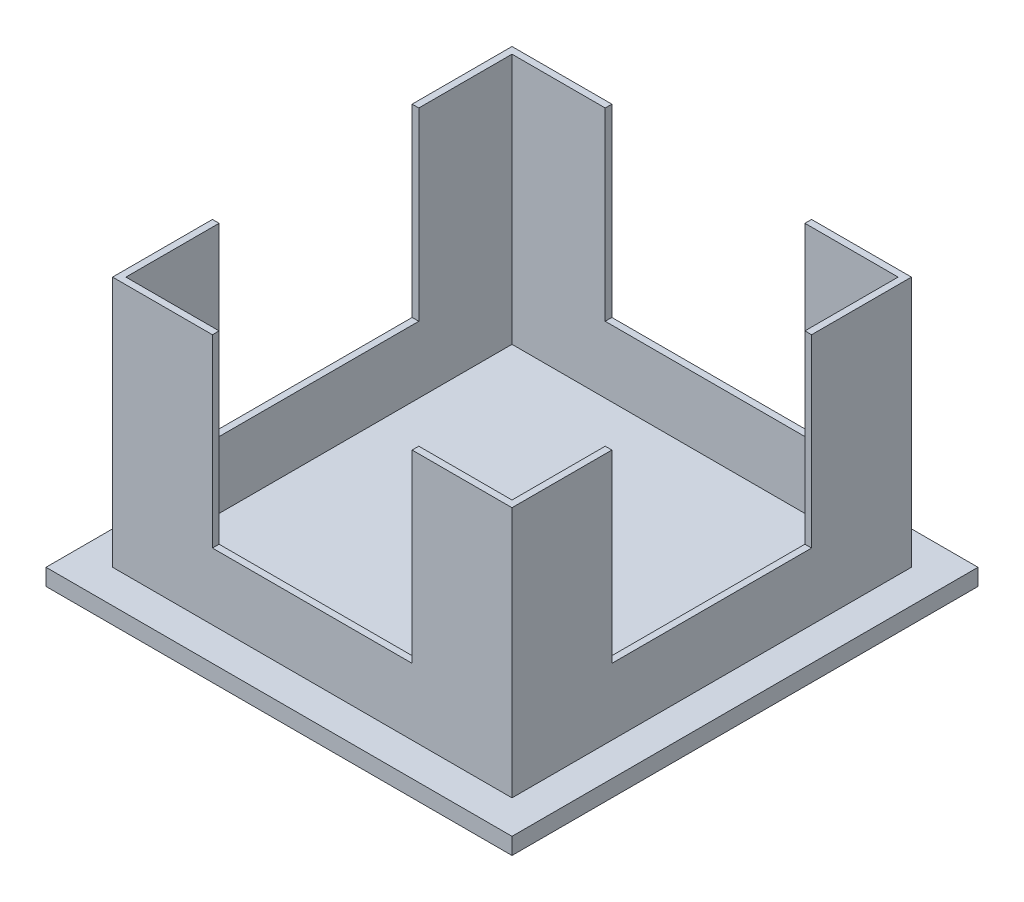
ISO-10303-21;
HEADER;
FILE_DESCRIPTION(('STEP AP214'),'2;1');
FILE_NAME('part.step','',(''),(''),'','','');
FILE_SCHEMA(('AUTOMOTIVE_DESIGN { 1 0 10303 214 1 1 1 1 }'));
ENDSEC;
DATA;
#1=APPLICATION_CONTEXT('core data for automotive mechanical design processes');
#2=APPLICATION_PROTOCOL_DEFINITION('international standard','automotive_design',2000,#1);
#3=PRODUCT_CONTEXT('',#1,'mechanical');
#4=PRODUCT('Part','Part','',(#3));
#5=PRODUCT_RELATED_PRODUCT_CATEGORY('part','',(#4));
#6=PRODUCT_DEFINITION_FORMATION('','',#4);
#7=PRODUCT_DEFINITION_CONTEXT('part definition',#1,'design');
#8=PRODUCT_DEFINITION('design','',#6,#7);
#9=PRODUCT_DEFINITION_SHAPE('','',#8);
#10=(LENGTH_UNIT() NAMED_UNIT(*) SI_UNIT(.MILLI.,.METRE.));
#11=(NAMED_UNIT(*) PLANE_ANGLE_UNIT() SI_UNIT($,.RADIAN.));
#12=(NAMED_UNIT(*) SI_UNIT($,.STERADIAN.) SOLID_ANGLE_UNIT());
#13=UNCERTAINTY_MEASURE_WITH_UNIT(LENGTH_MEASURE(1.E-05),#10,'distance_accuracy_value','');
#14=(GEOMETRIC_REPRESENTATION_CONTEXT(3) GLOBAL_UNCERTAINTY_ASSIGNED_CONTEXT((#13)) GLOBAL_UNIT_ASSIGNED_CONTEXT((#10,
#11,#12)) REPRESENTATION_CONTEXT('',''));
#15=CARTESIAN_POINT('',(0.,0.,0.));
#16=DIRECTION('',(0.,0.,1.));
#17=DIRECTION('',(1.,0.,0.));
#18=AXIS2_PLACEMENT_3D('',#15,#16,#17);
#19=CARTESIAN_POINT('',(0.,80.5,0.));
#20=DIRECTION('',(0.,-1.,0.));
#21=DIRECTION('',(0.,0.,-1.));
#22=AXIS2_PLACEMENT_3D('',#19,#20,#21);
#23=PLANE('',#22);
#24=DIRECTION('',(0.,0.,1.));
#25=VECTOR('',#24,1.);
#26=CARTESIAN_POINT('',(-58.,80.5,58.));
#27=LINE('',#26,#25);
#28=CARTESIAN_POINT('',(-58.,80.5,30.));
#29=VERTEX_POINT('',#28);
#30=CARTESIAN_POINT('',(-58.,80.5,58.));
#31=VERTEX_POINT('',#30);
#32=EDGE_CURVE('E346',#29,#31,#27,.T.);
#33=ORIENTED_EDGE('',*,*,#32,.F.);
#34=DIRECTION('',(1.,0.,0.));
#35=VECTOR('',#34,1.);
#36=CARTESIAN_POINT('',(-70.,80.5,30.));
#37=LINE('',#36,#35);
#38=CARTESIAN_POINT('',(-60.,80.5,30.));
#39=VERTEX_POINT('',#38);
#40=EDGE_CURVE('E264',#39,#29,#37,.T.);
#41=ORIENTED_EDGE('',*,*,#40,.F.);
#42=DIRECTION('',(0.,0.,1.));
#43=VECTOR('',#42,1.);
#44=CARTESIAN_POINT('',(-60.,80.5,60.));
#45=LINE('',#44,#43);
#46=CARTESIAN_POINT('',(-60.,80.5,60.));
#47=VERTEX_POINT('',#46);
#48=EDGE_CURVE('E395',#39,#47,#45,.T.);
#49=ORIENTED_EDGE('',*,*,#48,.T.);
#50=DIRECTION('',(1.,0.,0.));
#51=VECTOR('',#50,1.);
#52=CARTESIAN_POINT('',(-60.,80.5,60.));
#53=LINE('',#52,#51);
#54=CARTESIAN_POINT('',(-30.,80.5,60.));
#55=VERTEX_POINT('',#54);
#56=EDGE_CURVE('E400',#47,#55,#53,.T.);
#57=ORIENTED_EDGE('',*,*,#56,.T.);
#58=DIRECTION('',(0.,0.,-1.));
#59=VECTOR('',#58,1.);
#60=CARTESIAN_POINT('',(-30.,80.5,70.));
#61=LINE('',#60,#59);
#62=CARTESIAN_POINT('',(-30.,80.5,58.));
#63=VERTEX_POINT('',#62);
#64=EDGE_CURVE('E297',#55,#63,#61,.T.);
#65=ORIENTED_EDGE('',*,*,#64,.T.);
#66=DIRECTION('',(1.,0.,0.));
#67=VECTOR('',#66,1.);
#68=CARTESIAN_POINT('',(-58.,80.5,58.));
#69=LINE('',#68,#67);
#70=EDGE_CURVE('E352',#31,#63,#69,.T.);
#71=ORIENTED_EDGE('',*,*,#70,.F.);
#72=EDGE_LOOP('',(#33,#41,#49,#57,#65,#71));
#73=FACE_BOUND('',#72,.T.);
#74=ADVANCED_FACE('F45',(#73),#23,.F.);
#75=DIRECTION('',(0.,0.,-1.));
#76=VECTOR('',#75,1.);
#77=CARTESIAN_POINT('',(60.,80.5,60.));
#78=LINE('',#77,#76);
#79=CARTESIAN_POINT('',(60.,80.5,60.));
#80=VERTEX_POINT('',#79);
#81=CARTESIAN_POINT('',(60.,80.5,30.));
#82=VERTEX_POINT('',#81);
#83=EDGE_CURVE('E385',#80,#82,#78,.T.);
#84=ORIENTED_EDGE('',*,*,#83,.T.);
#85=CARTESIAN_POINT('',(58.,80.5,30.));
#86=VERTEX_POINT('',#85);
#87=EDGE_CURVE('E502',#86,#82,#37,.T.);
#88=ORIENTED_EDGE('',*,*,#87,.F.);
#89=DIRECTION('',(0.,0.,-1.));
#90=VECTOR('',#89,1.);
#91=CARTESIAN_POINT('',(58.,80.5,58.));
#92=LINE('',#91,#90);
#93=CARTESIAN_POINT('',(58.,80.5,58.));
#94=VERTEX_POINT('',#93);
#95=EDGE_CURVE('E336',#94,#86,#92,.T.);
#96=ORIENTED_EDGE('',*,*,#95,.F.);
#97=CARTESIAN_POINT('',(30.,80.5,58.));
#98=VERTEX_POINT('',#97);
#99=EDGE_CURVE('E351',#98,#94,#69,.T.);
#100=ORIENTED_EDGE('',*,*,#99,.F.);
#101=DIRECTION('',(0.,0.,-1.));
#102=VECTOR('',#101,1.);
#103=CARTESIAN_POINT('',(30.,80.5,70.));
#104=LINE('',#103,#102);
#105=CARTESIAN_POINT('',(30.,80.5,60.));
#106=VERTEX_POINT('',#105);
#107=EDGE_CURVE('E293',#106,#98,#104,.T.);
#108=ORIENTED_EDGE('',*,*,#107,.F.);
#109=EDGE_CURVE('E399',#106,#80,#53,.T.);
#110=ORIENTED_EDGE('',*,*,#109,.T.);
#111=EDGE_LOOP('',(#84,#88,#96,#100,#108,#110));
#112=FACE_BOUND('',#111,.T.);
#113=ADVANCED_FACE('F544',(#112),#23,.F.);
#114=CARTESIAN_POINT('',(-60.,80.5,-60.));
#115=VERTEX_POINT('',#114);
#116=CARTESIAN_POINT('',(-60.,80.5,-30.));
#117=VERTEX_POINT('',#116);
#118=EDGE_CURVE('E396',#115,#117,#45,.T.);
#119=ORIENTED_EDGE('',*,*,#118,.T.);
#120=DIRECTION('',(1.,0.,0.));
#121=VECTOR('',#120,1.);
#122=CARTESIAN_POINT('',(-70.,80.5,-30.));
#123=LINE('',#122,#121);
#124=CARTESIAN_POINT('',(-58.,80.5,-30.));
#125=VERTEX_POINT('',#124);
#126=EDGE_CURVE('E236',#117,#125,#123,.T.);
#127=ORIENTED_EDGE('',*,*,#126,.T.);
#128=CARTESIAN_POINT('',(-58.,80.5,-58.));
#129=VERTEX_POINT('',#128);
#130=EDGE_CURVE('E347',#129,#125,#27,.T.);
#131=ORIENTED_EDGE('',*,*,#130,.F.);
#132=DIRECTION('',(-1.,0.,0.));
#133=VECTOR('',#132,1.);
#134=CARTESIAN_POINT('',(-58.,80.5,-58.));
#135=LINE('',#134,#133);
#136=CARTESIAN_POINT('',(-30.,80.5,-58.));
#137=VERTEX_POINT('',#136);
#138=EDGE_CURVE('E340',#137,#129,#135,.T.);
#139=ORIENTED_EDGE('',*,*,#138,.F.);
#140=CARTESIAN_POINT('',(-30.,80.5,-60.));
#141=VERTEX_POINT('',#140);
#142=EDGE_CURVE('E282',#137,#141,#61,.T.);
#143=ORIENTED_EDGE('',*,*,#142,.T.);
#144=DIRECTION('',(-1.,0.,0.));
#145=VECTOR('',#144,1.);
#146=CARTESIAN_POINT('',(-60.,80.5,-60.));
#147=LINE('',#146,#145);
#148=EDGE_CURVE('E389',#141,#115,#147,.T.);
#149=ORIENTED_EDGE('',*,*,#148,.T.);
#150=EDGE_LOOP('',(#119,#127,#131,#139,#143,#149));
#151=FACE_BOUND('',#150,.T.);
#152=ADVANCED_FACE('F499',(#151),#23,.F.);
#153=CARTESIAN_POINT('',(0.,5.,0.));
#154=DIRECTION('',(0.,-1.,0.));
#155=DIRECTION('',(0.,0.,-1.));
#156=AXIS2_PLACEMENT_3D('',#153,#154,#155);
#157=PLANE('',#156);
#158=DIRECTION('',(0.,0.,-1.));
#159=VECTOR('',#158,1.);
#160=CARTESIAN_POINT('',(70.,5.,70.));
#161=LINE('',#160,#159);
#162=CARTESIAN_POINT('',(70.,5.,70.));
#163=VERTEX_POINT('',#162);
#164=CARTESIAN_POINT('',(70.,5.,-70.));
#165=VERTEX_POINT('',#164);
#166=EDGE_CURVE('E444',#163,#165,#161,.T.);
#167=ORIENTED_EDGE('',*,*,#166,.T.);
#168=DIRECTION('',(-1.,0.,0.));
#169=VECTOR('',#168,1.);
#170=CARTESIAN_POINT('',(-70.,5.,-70.));
#171=LINE('',#170,#169);
#172=CARTESIAN_POINT('',(-70.,5.,-70.));
#173=VERTEX_POINT('',#172);
#174=EDGE_CURVE('E448',#165,#173,#171,.T.);
#175=ORIENTED_EDGE('',*,*,#174,.T.);
#176=DIRECTION('',(0.,0.,1.));
#177=VECTOR('',#176,1.);
#178=CARTESIAN_POINT('',(-70.,5.,70.));
#179=LINE('',#178,#177);
#180=CARTESIAN_POINT('',(-70.,5.,70.));
#181=VERTEX_POINT('',#180);
#182=EDGE_CURVE('E452',#173,#181,#179,.T.);
#183=ORIENTED_EDGE('',*,*,#182,.T.);
#184=DIRECTION('',(1.,0.,0.));
#185=VECTOR('',#184,1.);
#186=CARTESIAN_POINT('',(-70.,5.,70.));
#187=LINE('',#186,#185);
#188=EDGE_CURVE('E455',#181,#163,#187,.T.);
#189=ORIENTED_EDGE('',*,*,#188,.T.);
#190=EDGE_LOOP('',(#167,#175,#183,#189));
#191=FACE_BOUND('',#190,.T.);
#192=DIRECTION('',(0.,0.,-1.));
#193=VECTOR('',#192,1.);
#194=CARTESIAN_POINT('',(60.,5.,60.));
#195=LINE('',#194,#193);
#196=CARTESIAN_POINT('',(60.,5.,60.));
#197=VERTEX_POINT('',#196);
#198=CARTESIAN_POINT('',(60.,5.,-60.));
#199=VERTEX_POINT('',#198);
#200=EDGE_CURVE('E384',#197,#199,#195,.T.);
#201=ORIENTED_EDGE('',*,*,#200,.F.);
#202=DIRECTION('',(1.,0.,0.));
#203=VECTOR('',#202,1.);
#204=CARTESIAN_POINT('',(-60.,5.,60.));
#205=LINE('',#204,#203);
#206=CARTESIAN_POINT('',(-60.,5.,60.));
#207=VERTEX_POINT('',#206);
#208=EDGE_CURVE('E416',#207,#197,#205,.T.);
#209=ORIENTED_EDGE('',*,*,#208,.F.);
#210=DIRECTION('',(0.,0.,1.));
#211=VECTOR('',#210,1.);
#212=CARTESIAN_POINT('',(-60.,5.,60.));
#213=LINE('',#212,#211);
#214=CARTESIAN_POINT('',(-60.,5.,-60.));
#215=VERTEX_POINT('',#214);
#216=EDGE_CURVE('E412',#215,#207,#213,.T.);
#217=ORIENTED_EDGE('',*,*,#216,.F.);
#218=DIRECTION('',(-1.,0.,0.));
#219=VECTOR('',#218,1.);
#220=CARTESIAN_POINT('',(-60.,5.,-60.));
#221=LINE('',#220,#219);
#222=EDGE_CURVE('E408',#199,#215,#221,.T.);
#223=ORIENTED_EDGE('',*,*,#222,.F.);
#224=EDGE_LOOP('',(#201,#209,#217,#223));
#225=FACE_BOUND('',#224,.T.);
#226=ADVANCED_FACE('F588',(#191,#225),#157,.F.);
#227=DIRECTION('',(1.,0.,0.));
#228=VECTOR('',#227,1.);
#229=CARTESIAN_POINT('',(-58.,5.,58.));
#230=LINE('',#229,#228);
#231=CARTESIAN_POINT('',(-58.,5.,58.));
#232=VERTEX_POINT('',#231);
#233=CARTESIAN_POINT('',(58.,5.,58.));
#234=VERTEX_POINT('',#233);
#235=EDGE_CURVE('E368',#232,#234,#230,.T.);
#236=ORIENTED_EDGE('',*,*,#235,.T.);
#237=DIRECTION('',(0.,0.,-1.));
#238=VECTOR('',#237,1.);
#239=CARTESIAN_POINT('',(58.,5.,58.));
#240=LINE('',#239,#238);
#241=CARTESIAN_POINT('',(58.,5.,-58.));
#242=VERTEX_POINT('',#241);
#243=EDGE_CURVE('E335',#234,#242,#240,.T.);
#244=ORIENTED_EDGE('',*,*,#243,.T.);
#245=DIRECTION('',(-1.,0.,0.));
#246=VECTOR('',#245,1.);
#247=CARTESIAN_POINT('',(-58.,5.,-58.));
#248=LINE('',#247,#246);
#249=CARTESIAN_POINT('',(-58.,5.,-58.));
#250=VERTEX_POINT('',#249);
#251=EDGE_CURVE('E360',#242,#250,#248,.T.);
#252=ORIENTED_EDGE('',*,*,#251,.T.);
#253=DIRECTION('',(0.,0.,1.));
#254=VECTOR('',#253,1.);
#255=CARTESIAN_POINT('',(-58.,5.,58.));
#256=LINE('',#255,#254);
#257=EDGE_CURVE('E364',#250,#232,#256,.T.);
#258=ORIENTED_EDGE('',*,*,#257,.T.);
#259=EDGE_LOOP('',(#236,#244,#252,#258));
#260=FACE_BOUND('',#259,.T.);
#261=CARTESIAN_POINT('',(0.,5.,0.));
#262=DIRECTION('',(0.,1.,0.));
#263=DIRECTION('',(0.,0.,1.));
#264=AXIS2_PLACEMENT_3D('',#261,#262,#263);
#265=CIRCLE('',#264,10.5);
#266=CARTESIAN_POINT('',(0.,5.,10.5));
#267=VERTEX_POINT('',#266);
#268=EDGE_CURVE('E436',#267,#267,#265,.T.);
#269=ORIENTED_EDGE('',*,*,#268,.F.);
#270=EDGE_LOOP('',(#269));
#271=FACE_BOUND('',#270,.T.);
#272=ADVANCED_FACE('F584',(#260,#271),#157,.F.);
#273=CARTESIAN_POINT('',(0.,0.,0.));
#274=DIRECTION('',(0.,-1.,0.));
#275=DIRECTION('',(0.,0.,-1.));
#276=AXIS2_PLACEMENT_3D('',#273,#274,#275);
#277=PLANE('',#276);
#278=DIRECTION('',(0.,0.,-1.));
#279=VECTOR('',#278,1.);
#280=CARTESIAN_POINT('',(70.,0.,70.));
#281=LINE('',#280,#279);
#282=CARTESIAN_POINT('',(70.,0.,70.));
#283=VERTEX_POINT('',#282);
#284=CARTESIAN_POINT('',(70.,0.,-70.));
#285=VERTEX_POINT('',#284);
#286=EDGE_CURVE('E440',#283,#285,#281,.T.);
#287=ORIENTED_EDGE('',*,*,#286,.F.);
#288=DIRECTION('',(1.,0.,0.));
#289=VECTOR('',#288,1.);
#290=CARTESIAN_POINT('',(-70.,0.,70.));
#291=LINE('',#290,#289);
#292=CARTESIAN_POINT('',(-70.,0.,70.));
#293=VERTEX_POINT('',#292);
#294=EDGE_CURVE('E449',#293,#283,#291,.T.);
#295=ORIENTED_EDGE('',*,*,#294,.F.);
#296=DIRECTION('',(0.,0.,1.));
#297=VECTOR('',#296,1.);
#298=CARTESIAN_POINT('',(-70.,0.,70.));
#299=LINE('',#298,#297);
#300=CARTESIAN_POINT('',(-70.,0.,-70.));
#301=VERTEX_POINT('',#300);
#302=EDGE_CURVE('E465',#301,#293,#299,.T.);
#303=ORIENTED_EDGE('',*,*,#302,.F.);
#304=DIRECTION('',(-1.,0.,0.));
#305=VECTOR('',#304,1.);
#306=CARTESIAN_POINT('',(-70.,0.,-70.));
#307=LINE('',#306,#305);
#308=EDGE_CURVE('E462',#285,#301,#307,.T.);
#309=ORIENTED_EDGE('',*,*,#308,.F.);
#310=EDGE_LOOP('',(#287,#295,#303,#309));
#311=FACE_BOUND('',#310,.T.);
#312=CARTESIAN_POINT('',(0.,0.,0.));
#313=DIRECTION('',(0.,1.,0.));
#314=DIRECTION('',(0.,0.,1.));
#315=AXIS2_PLACEMENT_3D('',#312,#313,#314);
#316=CIRCLE('',#315,10.5);
#317=CARTESIAN_POINT('',(0.,0.,10.5));
#318=VERTEX_POINT('',#317);
#319=EDGE_CURVE('E435',#318,#318,#316,.T.);
#320=ORIENTED_EDGE('',*,*,#319,.T.);
#321=EDGE_LOOP('',(#320));
#322=FACE_BOUND('',#321,.T.);
#323=ADVANCED_FACE('F587',(#311,#322),#277,.T.);
#324=CARTESIAN_POINT('',(70.,5.,70.));
#325=DIRECTION('',(-1.,0.,0.));
#326=DIRECTION('',(0.,0.,1.));
#327=AXIS2_PLACEMENT_3D('',#324,#325,#326);
#328=PLANE('',#327);
#329=ORIENTED_EDGE('',*,*,#286,.T.);
#330=DIRECTION('',(0.,-1.,0.));
#331=VECTOR('',#330,1.);
#332=CARTESIAN_POINT('',(70.,5.,-70.));
#333=LINE('',#332,#331);
#334=EDGE_CURVE('E481',#165,#285,#333,.T.);
#335=ORIENTED_EDGE('',*,*,#334,.F.);
#336=ORIENTED_EDGE('',*,*,#166,.F.);
#337=DIRECTION('',(0.,-1.,0.));
#338=VECTOR('',#337,1.);
#339=CARTESIAN_POINT('',(70.,5.,70.));
#340=LINE('',#339,#338);
#341=EDGE_CURVE('E458',#163,#283,#340,.T.);
#342=ORIENTED_EDGE('',*,*,#341,.T.);
#343=EDGE_LOOP('',(#329,#335,#336,#342));
#344=FACE_BOUND('',#343,.T.);
#345=ADVANCED_FACE('F47',(#344),#328,.F.);
#346=CARTESIAN_POINT('',(-70.,5.,-70.));
#347=DIRECTION('',(0.,0.,1.));
#348=DIRECTION('',(1.,0.,0.));
#349=AXIS2_PLACEMENT_3D('',#346,#347,#348);
#350=PLANE('',#349);
#351=ORIENTED_EDGE('',*,*,#308,.T.);
#352=DIRECTION('',(0.,-1.,0.));
#353=VECTOR('',#352,1.);
#354=CARTESIAN_POINT('',(-70.,5.,-70.));
#355=LINE('',#354,#353);
#356=EDGE_CURVE('E477',#173,#301,#355,.T.);
#357=ORIENTED_EDGE('',*,*,#356,.F.);
#358=ORIENTED_EDGE('',*,*,#174,.F.);
#359=ORIENTED_EDGE('',*,*,#334,.T.);
#360=EDGE_LOOP('',(#351,#357,#358,#359));
#361=FACE_BOUND('',#360,.T.);
#362=ADVANCED_FACE('F606',(#361),#350,.F.);
#363=CARTESIAN_POINT('',(-70.,5.,70.));
#364=DIRECTION('',(1.,0.,0.));
#365=DIRECTION('',(0.,0.,-1.));
#366=AXIS2_PLACEMENT_3D('',#363,#364,#365);
#367=PLANE('',#366);
#368=ORIENTED_EDGE('',*,*,#302,.T.);
#369=DIRECTION('',(0.,-1.,0.));
#370=VECTOR('',#369,1.);
#371=CARTESIAN_POINT('',(-70.,5.,70.));
#372=LINE('',#371,#370);
#373=EDGE_CURVE('E473',#181,#293,#372,.T.);
#374=ORIENTED_EDGE('',*,*,#373,.F.);
#375=ORIENTED_EDGE('',*,*,#182,.F.);
#376=ORIENTED_EDGE('',*,*,#356,.T.);
#377=EDGE_LOOP('',(#368,#374,#375,#376));
#378=FACE_BOUND('',#377,.T.);
#379=ADVANCED_FACE('F827',(#378),#367,.F.);
#380=CARTESIAN_POINT('',(-70.,5.,70.));
#381=DIRECTION('',(0.,0.,-1.));
#382=DIRECTION('',(-1.,0.,0.));
#383=AXIS2_PLACEMENT_3D('',#380,#381,#382);
#384=PLANE('',#383);
#385=ORIENTED_EDGE('',*,*,#294,.T.);
#386=ORIENTED_EDGE('',*,*,#341,.F.);
#387=ORIENTED_EDGE('',*,*,#188,.F.);
#388=ORIENTED_EDGE('',*,*,#373,.T.);
#389=EDGE_LOOP('',(#385,#386,#387,#388));
#390=FACE_BOUND('',#389,.T.);
#391=ADVANCED_FACE('F596',(#390),#384,.F.);
#392=CARTESIAN_POINT('',(0.,5.,0.));
#393=DIRECTION('',(0.,-1.,0.));
#394=DIRECTION('',(0.,0.,-1.));
#395=AXIS2_PLACEMENT_3D('',#392,#393,#394);
#396=CYLINDRICAL_SURFACE('',#395,10.5);
#397=ORIENTED_EDGE('',*,*,#268,.T.);
#398=EDGE_LOOP('',(#397));
#399=FACE_BOUND('',#398,.T.);
#400=ORIENTED_EDGE('',*,*,#319,.F.);
#401=EDGE_LOOP('',(#400));
#402=FACE_BOUND('',#401,.T.);
#403=ADVANCED_FACE('F592',(#399,#402),#396,.F.);
#404=CARTESIAN_POINT('',(58.,80.5,-30.));
#405=VERTEX_POINT('',#404);
#406=CARTESIAN_POINT('',(58.,80.5,-58.));
#407=VERTEX_POINT('',#406);
#408=EDGE_CURVE('E341',#405,#407,#92,.T.);
#409=ORIENTED_EDGE('',*,*,#408,.F.);
#410=CARTESIAN_POINT('',(60.,80.5,-30.));
#411=VERTEX_POINT('',#410);
#412=EDGE_CURVE('E250',#405,#411,#123,.T.);
#413=ORIENTED_EDGE('',*,*,#412,.T.);
#414=CARTESIAN_POINT('',(60.,80.5,-60.));
#415=VERTEX_POINT('',#414);
#416=EDGE_CURVE('E390',#411,#415,#78,.T.);
#417=ORIENTED_EDGE('',*,*,#416,.T.);
#418=CARTESIAN_POINT('',(30.,80.5,-60.));
#419=VERTEX_POINT('',#418);
#420=EDGE_CURVE('E391',#415,#419,#147,.T.);
#421=ORIENTED_EDGE('',*,*,#420,.T.);
#422=CARTESIAN_POINT('',(30.,80.5,-58.));
#423=VERTEX_POINT('',#422);
#424=EDGE_CURVE('E294',#423,#419,#104,.T.);
#425=ORIENTED_EDGE('',*,*,#424,.F.);
#426=EDGE_CURVE('E342',#407,#423,#135,.T.);
#427=ORIENTED_EDGE('',*,*,#426,.F.);
#428=EDGE_LOOP('',(#409,#413,#417,#421,#425,#427));
#429=FACE_BOUND('',#428,.T.);
#430=ADVANCED_FACE('F595',(#429),#23,.F.);
#431=CARTESIAN_POINT('',(60.,80.5,60.));
#432=DIRECTION('',(-1.,0.,0.));
#433=DIRECTION('',(0.,0.,1.));
#434=AXIS2_PLACEMENT_3D('',#431,#432,#433);
#435=PLANE('',#434);
#436=DIRECTION('',(0.,0.,1.));
#437=VECTOR('',#436,1.);
#438=CARTESIAN_POINT('',(60.,25.,60.));
#439=LINE('',#438,#437);
#440=CARTESIAN_POINT('',(60.,25.,-30.));
#441=VERTEX_POINT('',#440);
#442=CARTESIAN_POINT('',(60.,25.,30.));
#443=VERTEX_POINT('',#442);
#444=EDGE_CURVE('E257',#441,#443,#439,.T.);
#445=ORIENTED_EDGE('',*,*,#444,.T.);
#446=DIRECTION('',(0.,1.,0.));
#447=VECTOR('',#446,1.);
#448=CARTESIAN_POINT('',(60.,80.5,30.));
#449=LINE('',#448,#447);
#450=EDGE_CURVE('E278',#443,#82,#449,.T.);
#451=ORIENTED_EDGE('',*,*,#450,.T.);
#452=ORIENTED_EDGE('',*,*,#83,.F.);
#453=DIRECTION('',(0.,-1.,0.));
#454=VECTOR('',#453,1.);
#455=CARTESIAN_POINT('',(60.,80.5,60.));
#456=LINE('',#455,#454);
#457=EDGE_CURVE('E404',#80,#197,#456,.T.);
#458=ORIENTED_EDGE('',*,*,#457,.T.);
#459=ORIENTED_EDGE('',*,*,#200,.T.);
#460=DIRECTION('',(0.,-1.,0.));
#461=VECTOR('',#460,1.);
#462=CARTESIAN_POINT('',(60.,80.5,-60.));
#463=LINE('',#462,#461);
#464=EDGE_CURVE('E431',#415,#199,#463,.T.);
#465=ORIENTED_EDGE('',*,*,#464,.F.);
#466=ORIENTED_EDGE('',*,*,#416,.F.);
#467=DIRECTION('',(0.,-1.,0.));
#468=VECTOR('',#467,1.);
#469=CARTESIAN_POINT('',(60.,80.5,-30.));
#470=LINE('',#469,#468);
#471=EDGE_CURVE('E242',#411,#441,#470,.T.);
#472=ORIENTED_EDGE('',*,*,#471,.T.);
#473=EDGE_LOOP('',(#445,#451,#452,#458,#459,#465,#466,#472));
#474=FACE_BOUND('',#473,.T.);
#475=ADVANCED_FACE('F551',(#474),#435,.F.);
#476=CARTESIAN_POINT('',(-60.,80.5,-60.));
#477=DIRECTION('',(0.,0.,1.));
#478=DIRECTION('',(1.,0.,0.));
#479=AXIS2_PLACEMENT_3D('',#476,#477,#478);
#480=PLANE('',#479);
#481=ORIENTED_EDGE('',*,*,#148,.F.);
#482=DIRECTION('',(0.,-1.,0.));
#483=VECTOR('',#482,1.);
#484=CARTESIAN_POINT('',(-30.,80.5,-60.));
#485=LINE('',#484,#483);
#486=CARTESIAN_POINT('',(-30.,25.,-60.));
#487=VERTEX_POINT('',#486);
#488=EDGE_CURVE('E331',#141,#487,#485,.T.);
#489=ORIENTED_EDGE('',*,*,#488,.T.);
#490=DIRECTION('',(1.,0.,0.));
#491=VECTOR('',#490,1.);
#492=CARTESIAN_POINT('',(-60.,25.,-60.));
#493=LINE('',#492,#491);
#494=CARTESIAN_POINT('',(30.,25.,-60.));
#495=VERTEX_POINT('',#494);
#496=EDGE_CURVE('E320',#487,#495,#493,.T.);
#497=ORIENTED_EDGE('',*,*,#496,.T.);
#498=DIRECTION('',(0.,1.,0.));
#499=VECTOR('',#498,1.);
#500=CARTESIAN_POINT('',(30.,80.5,-60.));
#501=LINE('',#500,#499);
#502=EDGE_CURVE('E308',#495,#419,#501,.T.);
#503=ORIENTED_EDGE('',*,*,#502,.T.);
#504=ORIENTED_EDGE('',*,*,#420,.F.);
#505=ORIENTED_EDGE('',*,*,#464,.T.);
#506=ORIENTED_EDGE('',*,*,#222,.T.);
#507=DIRECTION('',(0.,-1.,0.));
#508=VECTOR('',#507,1.);
#509=CARTESIAN_POINT('',(-60.,80.5,-60.));
#510=LINE('',#509,#508);
#511=EDGE_CURVE('E427',#115,#215,#510,.T.);
#512=ORIENTED_EDGE('',*,*,#511,.F.);
#513=EDGE_LOOP('',(#481,#489,#497,#503,#504,#505,#506,#512));
#514=FACE_BOUND('',#513,.T.);
#515=ADVANCED_FACE('F624',(#514),#480,.F.);
#516=CARTESIAN_POINT('',(-60.,80.5,60.));
#517=DIRECTION('',(1.,0.,0.));
#518=DIRECTION('',(0.,0.,-1.));
#519=AXIS2_PLACEMENT_3D('',#516,#517,#518);
#520=PLANE('',#519);
#521=ORIENTED_EDGE('',*,*,#48,.F.);
#522=DIRECTION('',(0.,-1.,0.));
#523=VECTOR('',#522,1.);
#524=CARTESIAN_POINT('',(-60.,80.5,30.));
#525=LINE('',#524,#523);
#526=CARTESIAN_POINT('',(-60.,25.,30.));
#527=VERTEX_POINT('',#526);
#528=EDGE_CURVE('E255',#39,#527,#525,.T.);
#529=ORIENTED_EDGE('',*,*,#528,.T.);
#530=DIRECTION('',(0.,0.,-1.));
#531=VECTOR('',#530,1.);
#532=CARTESIAN_POINT('',(-60.,25.,60.));
#533=LINE('',#532,#531);
#534=CARTESIAN_POINT('',(-60.,25.,-30.));
#535=VERTEX_POINT('',#534);
#536=EDGE_CURVE('E246',#527,#535,#533,.T.);
#537=ORIENTED_EDGE('',*,*,#536,.T.);
#538=DIRECTION('',(0.,1.,0.));
#539=VECTOR('',#538,1.);
#540=CARTESIAN_POINT('',(-60.,80.5,-30.));
#541=LINE('',#540,#539);
#542=EDGE_CURVE('E230',#535,#117,#541,.T.);
#543=ORIENTED_EDGE('',*,*,#542,.T.);
#544=ORIENTED_EDGE('',*,*,#118,.F.);
#545=ORIENTED_EDGE('',*,*,#511,.T.);
#546=ORIENTED_EDGE('',*,*,#216,.T.);
#547=DIRECTION('',(0.,-1.,0.));
#548=VECTOR('',#547,1.);
#549=CARTESIAN_POINT('',(-60.,80.5,60.));
#550=LINE('',#549,#548);
#551=EDGE_CURVE('E423',#47,#207,#550,.T.);
#552=ORIENTED_EDGE('',*,*,#551,.F.);
#553=EDGE_LOOP('',(#521,#529,#537,#543,#544,#545,#546,#552));
#554=FACE_BOUND('',#553,.T.);
#555=ADVANCED_FACE('F254',(#554),#520,.F.);
#556=CARTESIAN_POINT('',(-60.,80.5,60.));
#557=DIRECTION('',(0.,0.,-1.));
#558=DIRECTION('',(-1.,0.,0.));
#559=AXIS2_PLACEMENT_3D('',#556,#557,#558);
#560=PLANE('',#559);
#561=DIRECTION('',(-1.,0.,0.));
#562=VECTOR('',#561,1.);
#563=CARTESIAN_POINT('',(-60.,25.,60.));
#564=LINE('',#563,#562);
#565=CARTESIAN_POINT('',(30.,25.,60.));
#566=VERTEX_POINT('',#565);
#567=CARTESIAN_POINT('',(-30.,25.,60.));
#568=VERTEX_POINT('',#567);
#569=EDGE_CURVE('E316',#566,#568,#564,.T.);
#570=ORIENTED_EDGE('',*,*,#569,.T.);
#571=DIRECTION('',(0.,1.,0.));
#572=VECTOR('',#571,1.);
#573=CARTESIAN_POINT('',(-30.,80.5,60.));
#574=LINE('',#573,#572);
#575=EDGE_CURVE('E327',#568,#55,#574,.T.);
#576=ORIENTED_EDGE('',*,*,#575,.T.);
#577=ORIENTED_EDGE('',*,*,#56,.F.);
#578=ORIENTED_EDGE('',*,*,#551,.T.);
#579=ORIENTED_EDGE('',*,*,#208,.T.);
#580=ORIENTED_EDGE('',*,*,#457,.F.);
#581=ORIENTED_EDGE('',*,*,#109,.F.);
#582=DIRECTION('',(0.,-1.,0.));
#583=VECTOR('',#582,1.);
#584=CARTESIAN_POINT('',(30.,80.5,60.));
#585=LINE('',#584,#583);
#586=EDGE_CURVE('E304',#106,#566,#585,.T.);
#587=ORIENTED_EDGE('',*,*,#586,.T.);
#588=EDGE_LOOP('',(#570,#576,#577,#578,#579,#580,#581,#587));
#589=FACE_BOUND('',#588,.T.);
#590=ADVANCED_FACE('F549',(#589),#560,.F.);
#591=CARTESIAN_POINT('',(58.,80.5,58.));
#592=DIRECTION('',(-1.,0.,0.));
#593=DIRECTION('',(0.,0.,1.));
#594=AXIS2_PLACEMENT_3D('',#591,#592,#593);
#595=PLANE('',#594);
#596=DIRECTION('',(0.,1.,0.));
#597=VECTOR('',#596,1.);
#598=CARTESIAN_POINT('',(58.,80.5,30.));
#599=LINE('',#598,#597);
#600=CARTESIAN_POINT('',(58.,25.,30.));
#601=VERTEX_POINT('',#600);
#602=EDGE_CURVE('E273',#601,#86,#599,.T.);
#603=ORIENTED_EDGE('',*,*,#602,.F.);
#604=DIRECTION('',(0.,0.,1.));
#605=VECTOR('',#604,1.);
#606=CARTESIAN_POINT('',(58.,25.,58.));
#607=LINE('',#606,#605);
#608=CARTESIAN_POINT('',(58.,25.,-30.));
#609=VERTEX_POINT('',#608);
#610=EDGE_CURVE('E258',#609,#601,#607,.T.);
#611=ORIENTED_EDGE('',*,*,#610,.F.);
#612=DIRECTION('',(0.,-1.,0.));
#613=VECTOR('',#612,1.);
#614=CARTESIAN_POINT('',(58.,80.5,-30.));
#615=LINE('',#614,#613);
#616=EDGE_CURVE('E243',#405,#609,#615,.T.);
#617=ORIENTED_EDGE('',*,*,#616,.F.);
#618=ORIENTED_EDGE('',*,*,#408,.T.);
#619=DIRECTION('',(0.,-1.,0.));
#620=VECTOR('',#619,1.);
#621=CARTESIAN_POINT('',(58.,80.5,-58.));
#622=LINE('',#621,#620);
#623=EDGE_CURVE('E380',#407,#242,#622,.T.);
#624=ORIENTED_EDGE('',*,*,#623,.T.);
#625=ORIENTED_EDGE('',*,*,#243,.F.);
#626=DIRECTION('',(0.,-1.,0.));
#627=VECTOR('',#626,1.);
#628=CARTESIAN_POINT('',(58.,80.5,58.));
#629=LINE('',#628,#627);
#630=EDGE_CURVE('E356',#94,#234,#629,.T.);
#631=ORIENTED_EDGE('',*,*,#630,.F.);
#632=ORIENTED_EDGE('',*,*,#95,.T.);
#633=EDGE_LOOP('',(#603,#611,#617,#618,#624,#625,#631,#632));
#634=FACE_BOUND('',#633,.T.);
#635=ADVANCED_FACE('F581',(#634),#595,.T.);
#636=CARTESIAN_POINT('',(-58.,80.5,-58.));
#637=DIRECTION('',(0.,0.,1.));
#638=DIRECTION('',(1.,0.,0.));
#639=AXIS2_PLACEMENT_3D('',#636,#637,#638);
#640=PLANE('',#639);
#641=DIRECTION('',(0.,-1.,0.));
#642=VECTOR('',#641,1.);
#643=CARTESIAN_POINT('',(-30.,80.5,-58.));
#644=LINE('',#643,#642);
#645=CARTESIAN_POINT('',(-30.,25.,-58.));
#646=VERTEX_POINT('',#645);
#647=EDGE_CURVE('E324',#137,#646,#644,.T.);
#648=ORIENTED_EDGE('',*,*,#647,.F.);
#649=ORIENTED_EDGE('',*,*,#138,.T.);
#650=DIRECTION('',(0.,-1.,0.));
#651=VECTOR('',#650,1.);
#652=CARTESIAN_POINT('',(-58.,80.5,-58.));
#653=LINE('',#652,#651);
#654=EDGE_CURVE('E377',#129,#250,#653,.T.);
#655=ORIENTED_EDGE('',*,*,#654,.T.);
#656=ORIENTED_EDGE('',*,*,#251,.F.);
#657=ORIENTED_EDGE('',*,*,#623,.F.);
#658=ORIENTED_EDGE('',*,*,#426,.T.);
#659=DIRECTION('',(0.,1.,0.));
#660=VECTOR('',#659,1.);
#661=CARTESIAN_POINT('',(30.,80.5,-58.));
#662=LINE('',#661,#660);
#663=CARTESIAN_POINT('',(30.,25.,-58.));
#664=VERTEX_POINT('',#663);
#665=EDGE_CURVE('E301',#664,#423,#662,.T.);
#666=ORIENTED_EDGE('',*,*,#665,.F.);
#667=DIRECTION('',(1.,0.,0.));
#668=VECTOR('',#667,1.);
#669=CARTESIAN_POINT('',(-58.,25.,-58.));
#670=LINE('',#669,#668);
#671=EDGE_CURVE('E312',#646,#664,#670,.T.);
#672=ORIENTED_EDGE('',*,*,#671,.F.);
#673=EDGE_LOOP('',(#648,#649,#655,#656,#657,#658,#666,#672));
#674=FACE_BOUND('',#673,.T.);
#675=ADVANCED_FACE('F510',(#674),#640,.T.);
#676=CARTESIAN_POINT('',(-58.,80.5,58.));
#677=DIRECTION('',(1.,0.,0.));
#678=DIRECTION('',(0.,0.,-1.));
#679=AXIS2_PLACEMENT_3D('',#676,#677,#678);
#680=PLANE('',#679);
#681=DIRECTION('',(0.,-1.,0.));
#682=VECTOR('',#681,1.);
#683=CARTESIAN_POINT('',(-58.,80.5,30.));
#684=LINE('',#683,#682);
#685=CARTESIAN_POINT('',(-58.,25.,30.));
#686=VERTEX_POINT('',#685);
#687=EDGE_CURVE('E11',#29,#686,#684,.T.);
#688=ORIENTED_EDGE('',*,*,#687,.F.);
#689=ORIENTED_EDGE('',*,*,#32,.T.);
#690=DIRECTION('',(0.,-1.,0.));
#691=VECTOR('',#690,1.);
#692=CARTESIAN_POINT('',(-58.,80.5,58.));
#693=LINE('',#692,#691);
#694=EDGE_CURVE('E374',#31,#232,#693,.T.);
#695=ORIENTED_EDGE('',*,*,#694,.T.);
#696=ORIENTED_EDGE('',*,*,#257,.F.);
#697=ORIENTED_EDGE('',*,*,#654,.F.);
#698=ORIENTED_EDGE('',*,*,#130,.T.);
#699=DIRECTION('',(0.,1.,0.));
#700=VECTOR('',#699,1.);
#701=CARTESIAN_POINT('',(-58.,80.5,-30.));
#702=LINE('',#701,#700);
#703=CARTESIAN_POINT('',(-58.,25.,-30.));
#704=VERTEX_POINT('',#703);
#705=EDGE_CURVE('E54',#704,#125,#702,.T.);
#706=ORIENTED_EDGE('',*,*,#705,.F.);
#707=DIRECTION('',(0.,0.,-1.));
#708=VECTOR('',#707,1.);
#709=CARTESIAN_POINT('',(-58.,25.,58.));
#710=LINE('',#709,#708);
#711=EDGE_CURVE('E248',#686,#704,#710,.T.);
#712=ORIENTED_EDGE('',*,*,#711,.F.);
#713=EDGE_LOOP('',(#688,#689,#695,#696,#697,#698,#706,#712));
#714=FACE_BOUND('',#713,.T.);
#715=ADVANCED_FACE('F506',(#714),#680,.T.);
#716=CARTESIAN_POINT('',(-58.,80.5,58.));
#717=DIRECTION('',(0.,0.,-1.));
#718=DIRECTION('',(-1.,0.,0.));
#719=AXIS2_PLACEMENT_3D('',#716,#717,#718);
#720=PLANE('',#719);
#721=DIRECTION('',(0.,1.,0.));
#722=VECTOR('',#721,1.);
#723=CARTESIAN_POINT('',(-30.,80.5,58.));
#724=LINE('',#723,#722);
#725=CARTESIAN_POINT('',(-30.,25.,58.));
#726=VERTEX_POINT('',#725);
#727=EDGE_CURVE('E491',#726,#63,#724,.T.);
#728=ORIENTED_EDGE('',*,*,#727,.F.);
#729=DIRECTION('',(-1.,0.,0.));
#730=VECTOR('',#729,1.);
#731=CARTESIAN_POINT('',(-58.,25.,58.));
#732=LINE('',#731,#730);
#733=CARTESIAN_POINT('',(30.,25.,58.));
#734=VERTEX_POINT('',#733);
#735=EDGE_CURVE('E488',#734,#726,#732,.T.);
#736=ORIENTED_EDGE('',*,*,#735,.F.);
#737=DIRECTION('',(0.,-1.,0.));
#738=VECTOR('',#737,1.);
#739=CARTESIAN_POINT('',(30.,80.5,58.));
#740=LINE('',#739,#738);
#741=EDGE_CURVE('E485',#98,#734,#740,.T.);
#742=ORIENTED_EDGE('',*,*,#741,.F.);
#743=ORIENTED_EDGE('',*,*,#99,.T.);
#744=ORIENTED_EDGE('',*,*,#630,.T.);
#745=ORIENTED_EDGE('',*,*,#235,.F.);
#746=ORIENTED_EDGE('',*,*,#694,.F.);
#747=ORIENTED_EDGE('',*,*,#70,.T.);
#748=EDGE_LOOP('',(#728,#736,#742,#743,#744,#745,#746,#747));
#749=FACE_BOUND('',#748,.T.);
#750=ADVANCED_FACE('F531',(#749),#720,.T.);
#751=CARTESIAN_POINT('',(30.,80.5,70.));
#752=DIRECTION('',(1.,0.,0.));
#753=DIRECTION('',(0.,1.,0.));
#754=AXIS2_PLACEMENT_3D('',#751,#752,#753);
#755=PLANE('',#754);
#756=ORIENTED_EDGE('',*,*,#107,.T.);
#757=ORIENTED_EDGE('',*,*,#741,.T.);
#758=DIRECTION('',(0.,0.,-1.));
#759=VECTOR('',#758,1.);
#760=CARTESIAN_POINT('',(30.,25.,70.));
#761=LINE('',#760,#759);
#762=EDGE_CURVE('E288',#566,#734,#761,.T.);
#763=ORIENTED_EDGE('',*,*,#762,.F.);
#764=ORIENTED_EDGE('',*,*,#586,.F.);
#765=EDGE_LOOP('',(#756,#757,#763,#764));
#766=FACE_BOUND('',#765,.T.);
#767=ADVANCED_FACE('F652',(#766),#755,.F.);
#768=CARTESIAN_POINT('',(-30.,25.,70.));
#769=DIRECTION('',(0.,-1.,0.));
#770=DIRECTION('',(0.,0.,-1.));
#771=AXIS2_PLACEMENT_3D('',#768,#769,#770);
#772=PLANE('',#771);
#773=ORIENTED_EDGE('',*,*,#762,.T.);
#774=ORIENTED_EDGE('',*,*,#735,.T.);
#775=DIRECTION('',(0.,0.,-1.));
#776=VECTOR('',#775,1.);
#777=CARTESIAN_POINT('',(-30.,25.,70.));
#778=LINE('',#777,#776);
#779=EDGE_CURVE('E287',#568,#726,#778,.T.);
#780=ORIENTED_EDGE('',*,*,#779,.F.);
#781=ORIENTED_EDGE('',*,*,#569,.F.);
#782=EDGE_LOOP('',(#773,#774,#780,#781));
#783=FACE_BOUND('',#782,.T.);
#784=ADVANCED_FACE('F574',(#783),#772,.F.);
#785=CARTESIAN_POINT('',(-30.,80.5,70.));
#786=DIRECTION('',(-1.,0.,0.));
#787=DIRECTION('',(0.,-1.,0.));
#788=AXIS2_PLACEMENT_3D('',#785,#786,#787);
#789=PLANE('',#788);
#790=ORIENTED_EDGE('',*,*,#779,.T.);
#791=ORIENTED_EDGE('',*,*,#727,.T.);
#792=ORIENTED_EDGE('',*,*,#64,.F.);
#793=ORIENTED_EDGE('',*,*,#575,.F.);
#794=EDGE_LOOP('',(#790,#791,#792,#793));
#795=FACE_BOUND('',#794,.T.);
#796=ADVANCED_FACE('F572',(#795),#789,.F.);
#797=ORIENTED_EDGE('',*,*,#142,.F.);
#798=ORIENTED_EDGE('',*,*,#647,.T.);
#799=EDGE_CURVE('E283',#646,#487,#778,.T.);
#800=ORIENTED_EDGE('',*,*,#799,.T.);
#801=ORIENTED_EDGE('',*,*,#488,.F.);
#802=EDGE_LOOP('',(#797,#798,#800,#801));
#803=FACE_BOUND('',#802,.T.);
#804=ADVANCED_FACE('F653',(#803),#789,.F.);
#805=ORIENTED_EDGE('',*,*,#799,.F.);
#806=ORIENTED_EDGE('',*,*,#671,.T.);
#807=EDGE_CURVE('E289',#664,#495,#761,.T.);
#808=ORIENTED_EDGE('',*,*,#807,.T.);
#809=ORIENTED_EDGE('',*,*,#496,.F.);
#810=EDGE_LOOP('',(#805,#806,#808,#809));
#811=FACE_BOUND('',#810,.T.);
#812=ADVANCED_FACE('F656',(#811),#772,.F.);
#813=ORIENTED_EDGE('',*,*,#807,.F.);
#814=ORIENTED_EDGE('',*,*,#665,.T.);
#815=ORIENTED_EDGE('',*,*,#424,.T.);
#816=ORIENTED_EDGE('',*,*,#502,.F.);
#817=EDGE_LOOP('',(#813,#814,#815,#816));
#818=FACE_BOUND('',#817,.T.);
#819=ADVANCED_FACE('F658',(#818),#755,.F.);
#820=CARTESIAN_POINT('',(-70.,25.,30.));
#821=DIRECTION('',(0.,-1.,0.));
#822=DIRECTION('',(0.,0.,-1.));
#823=AXIS2_PLACEMENT_3D('',#820,#821,#822);
#824=PLANE('',#823);
#825=DIRECTION('',(1.,0.,0.));
#826=VECTOR('',#825,1.);
#827=CARTESIAN_POINT('',(-70.,25.,30.));
#828=LINE('',#827,#826);
#829=EDGE_CURVE('E69',#527,#686,#828,.T.);
#830=ORIENTED_EDGE('',*,*,#829,.T.);
#831=ORIENTED_EDGE('',*,*,#711,.T.);
#832=DIRECTION('',(1.,0.,0.));
#833=VECTOR('',#832,1.);
#834=CARTESIAN_POINT('',(-70.,25.,-30.));
#835=LINE('',#834,#833);
#836=EDGE_CURVE('E233',#535,#704,#835,.T.);
#837=ORIENTED_EDGE('',*,*,#836,.F.);
#838=ORIENTED_EDGE('',*,*,#536,.F.);
#839=EDGE_LOOP('',(#830,#831,#837,#838));
#840=FACE_BOUND('',#839,.T.);
#841=ADVANCED_FACE('F245',(#840),#824,.F.);
#842=CARTESIAN_POINT('',(-70.,80.5,-30.));
#843=DIRECTION('',(0.,0.,-1.));
#844=DIRECTION('',(0.,1.,0.));
#845=AXIS2_PLACEMENT_3D('',#842,#843,#844);
#846=PLANE('',#845);
#847=ORIENTED_EDGE('',*,*,#836,.T.);
#848=ORIENTED_EDGE('',*,*,#705,.T.);
#849=ORIENTED_EDGE('',*,*,#126,.F.);
#850=ORIENTED_EDGE('',*,*,#542,.F.);
#851=EDGE_LOOP('',(#847,#848,#849,#850));
#852=FACE_BOUND('',#851,.T.);
#853=ADVANCED_FACE('F232',(#852),#846,.F.);
#854=CARTESIAN_POINT('',(-70.,80.5,30.));
#855=DIRECTION('',(0.,0.,1.));
#856=DIRECTION('',(0.,-1.,0.));
#857=AXIS2_PLACEMENT_3D('',#854,#855,#856);
#858=PLANE('',#857);
#859=ORIENTED_EDGE('',*,*,#40,.T.);
#860=ORIENTED_EDGE('',*,*,#687,.T.);
#861=ORIENTED_EDGE('',*,*,#829,.F.);
#862=ORIENTED_EDGE('',*,*,#528,.F.);
#863=EDGE_LOOP('',(#859,#860,#861,#862));
#864=FACE_BOUND('',#863,.T.);
#865=ADVANCED_FACE('F569',(#864),#858,.F.);
#866=EDGE_CURVE('E556',#601,#443,#828,.T.);
#867=ORIENTED_EDGE('',*,*,#866,.F.);
#868=ORIENTED_EDGE('',*,*,#602,.T.);
#869=ORIENTED_EDGE('',*,*,#87,.T.);
#870=ORIENTED_EDGE('',*,*,#450,.F.);
#871=EDGE_LOOP('',(#867,#868,#869,#870));
#872=FACE_BOUND('',#871,.T.);
#873=ADVANCED_FACE('F555',(#872),#858,.F.);
#874=ORIENTED_EDGE('',*,*,#412,.F.);
#875=ORIENTED_EDGE('',*,*,#616,.T.);
#876=EDGE_CURVE('E61',#609,#441,#835,.T.);
#877=ORIENTED_EDGE('',*,*,#876,.T.);
#878=ORIENTED_EDGE('',*,*,#471,.F.);
#879=EDGE_LOOP('',(#874,#875,#877,#878));
#880=FACE_BOUND('',#879,.T.);
#881=ADVANCED_FACE('F666',(#880),#846,.F.);
#882=ORIENTED_EDGE('',*,*,#876,.F.);
#883=ORIENTED_EDGE('',*,*,#610,.T.);
#884=ORIENTED_EDGE('',*,*,#866,.T.);
#885=ORIENTED_EDGE('',*,*,#444,.F.);
#886=EDGE_LOOP('',(#882,#883,#884,#885));
#887=FACE_BOUND('',#886,.T.);
#888=ADVANCED_FACE('F558',(#887),#824,.F.);
#889=CLOSED_SHELL('',(#74,#113,#152,#226,#272,#323,#345,#362,#379,#391,#403,#430,#475,#515,#555,
#590,#635,#675,#715,#750,#767,#784,#796,#804,#812,#819,#841,#853,#865,#873,#881,#888));
#890=MANIFOLD_SOLID_BREP('B2',#889);
#891=ADVANCED_BREP_SHAPE_REPRESENTATION('',(#18,#890),#14);
#892=SHAPE_DEFINITION_REPRESENTATION(#9,#891);
ENDSEC;
END-ISO-10303-21;
